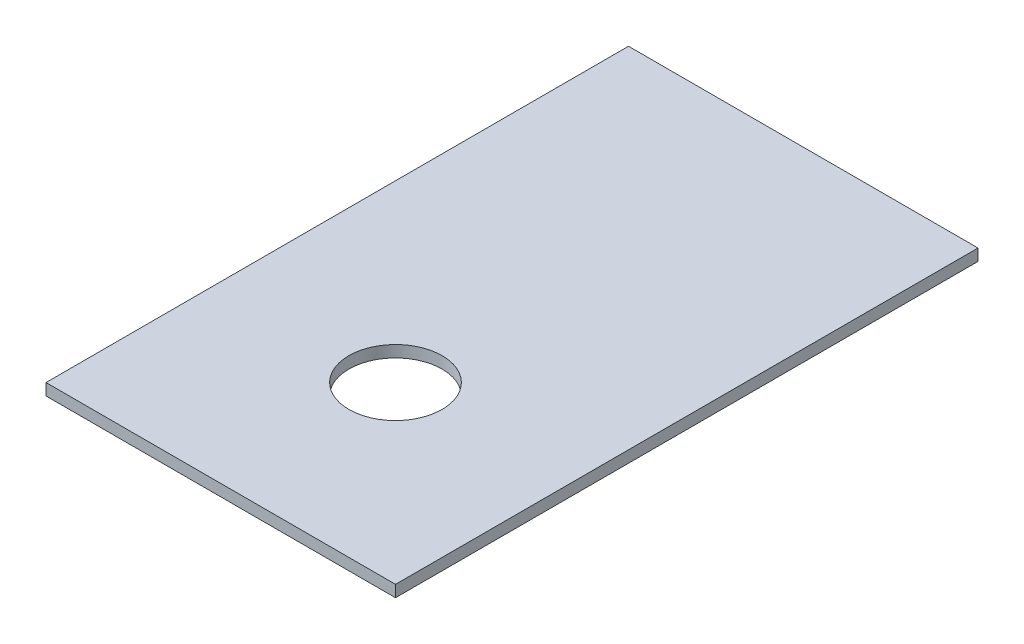
ISO-10303-21;
HEADER;
FILE_DESCRIPTION(('STEP AP214'),'2;1');
FILE_NAME('part.step','',(''),(''),'','','');
FILE_SCHEMA(('AUTOMOTIVE_DESIGN { 1 0 10303 214 1 1 1 1 }'));
ENDSEC;
DATA;
#1=APPLICATION_CONTEXT('core data for automotive mechanical design processes');
#2=APPLICATION_PROTOCOL_DEFINITION('international standard','automotive_design',2000,#1);
#3=PRODUCT_CONTEXT('',#1,'mechanical');
#4=PRODUCT('Part','Part','',(#3));
#5=PRODUCT_RELATED_PRODUCT_CATEGORY('part','',(#4));
#6=PRODUCT_DEFINITION_FORMATION('','',#4);
#7=PRODUCT_DEFINITION_CONTEXT('part definition',#1,'design');
#8=PRODUCT_DEFINITION('design','',#6,#7);
#9=PRODUCT_DEFINITION_SHAPE('','',#8);
#10=(LENGTH_UNIT() NAMED_UNIT(*) SI_UNIT(.MILLI.,.METRE.));
#11=(NAMED_UNIT(*) PLANE_ANGLE_UNIT() SI_UNIT($,.RADIAN.));
#12=(NAMED_UNIT(*) SI_UNIT($,.STERADIAN.) SOLID_ANGLE_UNIT());
#13=UNCERTAINTY_MEASURE_WITH_UNIT(LENGTH_MEASURE(1.E-05),#10,'distance_accuracy_value','');
#14=(GEOMETRIC_REPRESENTATION_CONTEXT(3) GLOBAL_UNCERTAINTY_ASSIGNED_CONTEXT((#13)) GLOBAL_UNIT_ASSIGNED_CONTEXT((#10,
#11,#12)) REPRESENTATION_CONTEXT('',''));
#15=CARTESIAN_POINT('',(0.,0.,0.));
#16=DIRECTION('',(0.,0.,1.));
#17=DIRECTION('',(1.,0.,0.));
#18=AXIS2_PLACEMENT_3D('',#15,#16,#17);
#19=CARTESIAN_POINT('',(0.,-0.01,0.85));
#20=DIRECTION('',(0.,1.,0.));
#21=DIRECTION('',(1.,0.,0.));
#22=AXIS2_PLACEMENT_3D('',#19,#20,#21);
#23=CYLINDRICAL_SURFACE('',#22,0.04);
#24=CARTESIAN_POINT('',(-0.04,-0.01,0.85));
#25=CARTESIAN_POINT('',(-0.04,0.,0.85));
#26=(BOUNDED_CURVE() B_SPLINE_CURVE(1,(#24,#25),.UNSPECIFIED.,.F.,
.F.) B_SPLINE_CURVE_WITH_KNOTS((2,2),(0.,0.01),
.UNSPECIFIED.) CURVE() GEOMETRIC_REPRESENTATION_ITEM() RATIONAL_B_SPLINE_CURVE((1.,1.)) REPRESENTATION_ITEM(''));
#27=CARTESIAN_POINT('',(-0.04,-0.01,0.85));
#28=VERTEX_POINT('',#27);
#29=CARTESIAN_POINT('',(-0.04,0.,0.85));
#30=VERTEX_POINT('',#29);
#31=EDGE_CURVE('E11',#28,#30,#26,.T.);
#32=ORIENTED_EDGE('',*,*,#31,.T.);
#33=CARTESIAN_POINT('',(0.,0.,0.85));
#34=DIRECTION('',(0.,-1.,0.));
#35=DIRECTION('',(1.,0.,0.));
#36=AXIS2_PLACEMENT_3D('',#33,#34,#35);
#37=CIRCLE('',#36,0.04);
#38=EDGE_CURVE('E136',#30,#30,#37,.T.);
#39=ORIENTED_EDGE('',*,*,#38,.F.);
#40=ORIENTED_EDGE('',*,*,#31,.F.);
#41=CARTESIAN_POINT('',(0.,-0.01,0.85));
#42=DIRECTION('',(0.,1.,0.));
#43=DIRECTION('',(1.,0.,0.));
#44=AXIS2_PLACEMENT_3D('',#41,#42,#43);
#45=CIRCLE('',#44,0.04);
#46=EDGE_CURVE('E21',#28,#28,#45,.T.);
#47=ORIENTED_EDGE('',*,*,#46,.F.);
#48=EDGE_LOOP('',(#32,#39,#40,#47));
#49=FACE_BOUND('',#48,.T.);
#50=ADVANCED_FACE('F17',(#49),#23,.F.);
#51=CARTESIAN_POINT('',(-0.15,0.,0.5));
#52=DIRECTION('',(0.,0.,-1.));
#53=DIRECTION('',(0.,-1.,0.));
#54=AXIS2_PLACEMENT_3D('',#51,#52,#53);
#55=PLANE('',#54);
#56=DIRECTION('',(1.,0.,0.));
#57=VECTOR('',#56,1.);
#58=CARTESIAN_POINT('',(-0.15,0.,0.5));
#59=LINE('',#58,#57);
#60=CARTESIAN_POINT('',(-0.15,0.,0.5));
#61=VERTEX_POINT('',#60);
#62=CARTESIAN_POINT('',(0.15,0.,0.5));
#63=VERTEX_POINT('',#62);
#64=EDGE_CURVE('E127',#61,#63,#59,.T.);
#65=ORIENTED_EDGE('',*,*,#64,.T.);
#66=DIRECTION('',(0.,-1.,0.));
#67=VECTOR('',#66,1.);
#68=CARTESIAN_POINT('',(0.15,0.,0.5));
#69=LINE('',#68,#67);
#70=CARTESIAN_POINT('',(0.15,-0.01,0.5));
#71=VERTEX_POINT('',#70);
#72=EDGE_CURVE('E79',#63,#71,#69,.T.);
#73=ORIENTED_EDGE('',*,*,#72,.T.);
#74=DIRECTION('',(1.,0.,0.));
#75=VECTOR('',#74,1.);
#76=CARTESIAN_POINT('',(-0.15,-0.01,0.5));
#77=LINE('',#76,#75);
#78=CARTESIAN_POINT('',(-0.15,-0.01,0.5));
#79=VERTEX_POINT('',#78);
#80=EDGE_CURVE('E92',#79,#71,#77,.T.);
#81=ORIENTED_EDGE('',*,*,#80,.F.);
#82=DIRECTION('',(0.,-1.,0.));
#83=VECTOR('',#82,1.);
#84=CARTESIAN_POINT('',(-0.15,0.,0.5));
#85=LINE('',#84,#83);
#86=EDGE_CURVE('E28',#61,#79,#85,.T.);
#87=ORIENTED_EDGE('',*,*,#86,.F.);
#88=EDGE_LOOP('',(#65,#73,#81,#87));
#89=FACE_BOUND('',#88,.T.);
#90=ADVANCED_FACE('F219',(#89),#55,.T.);
#91=CARTESIAN_POINT('',(-0.15,0.,1.));
#92=DIRECTION('',(-1.,0.,0.));
#93=DIRECTION('',(0.,1.,0.));
#94=AXIS2_PLACEMENT_3D('',#91,#92,#93);
#95=PLANE('',#94);
#96=DIRECTION('',(0.,0.,-1.));
#97=VECTOR('',#96,1.);
#98=CARTESIAN_POINT('',(-0.15,0.,1.));
#99=LINE('',#98,#97);
#100=CARTESIAN_POINT('',(-0.15,0.,1.));
#101=VERTEX_POINT('',#100);
#102=EDGE_CURVE('E125',#101,#61,#99,.T.);
#103=ORIENTED_EDGE('',*,*,#102,.T.);
#104=ORIENTED_EDGE('',*,*,#86,.T.);
#105=DIRECTION('',(0.,0.,-1.));
#106=VECTOR('',#105,1.);
#107=CARTESIAN_POINT('',(-0.15,-0.01,1.));
#108=LINE('',#107,#106);
#109=CARTESIAN_POINT('',(-0.15,-0.01,1.));
#110=VERTEX_POINT('',#109);
#111=EDGE_CURVE('E101',#110,#79,#108,.T.);
#112=ORIENTED_EDGE('',*,*,#111,.F.);
#113=DIRECTION('',(0.,-1.,0.));
#114=VECTOR('',#113,1.);
#115=CARTESIAN_POINT('',(-0.15,0.,1.));
#116=LINE('',#115,#114);
#117=EDGE_CURVE('E97',#101,#110,#116,.T.);
#118=ORIENTED_EDGE('',*,*,#117,.F.);
#119=EDGE_LOOP('',(#103,#104,#112,#118));
#120=FACE_BOUND('',#119,.T.);
#121=ADVANCED_FACE('F19',(#120),#95,.T.);
#122=CARTESIAN_POINT('',(0.15,0.,1.));
#123=DIRECTION('',(0.,0.,1.));
#124=DIRECTION('',(1.,0.,0.));
#125=AXIS2_PLACEMENT_3D('',#122,#123,#124);
#126=PLANE('',#125);
#127=DIRECTION('',(-1.,0.,0.));
#128=VECTOR('',#127,1.);
#129=CARTESIAN_POINT('',(1.,0.,1.));
#130=LINE('',#129,#128);
#131=CARTESIAN_POINT('',(0.15,0.,1.));
#132=VERTEX_POINT('',#131);
#133=EDGE_CURVE('E113',#132,#101,#130,.T.);
#134=ORIENTED_EDGE('',*,*,#133,.T.);
#135=ORIENTED_EDGE('',*,*,#117,.T.);
#136=DIRECTION('',(-1.,0.,0.));
#137=VECTOR('',#136,1.);
#138=CARTESIAN_POINT('',(1.,-0.01,1.));
#139=LINE('',#138,#137);
#140=CARTESIAN_POINT('',(0.15,-0.01,1.));
#141=VERTEX_POINT('',#140);
#142=EDGE_CURVE('E95',#141,#110,#139,.T.);
#143=ORIENTED_EDGE('',*,*,#142,.F.);
#144=DIRECTION('',(0.,-1.,0.));
#145=VECTOR('',#144,1.);
#146=CARTESIAN_POINT('',(0.15,0.,1.));
#147=LINE('',#146,#145);
#148=EDGE_CURVE('E67',#132,#141,#147,.T.);
#149=ORIENTED_EDGE('',*,*,#148,.F.);
#150=EDGE_LOOP('',(#134,#135,#143,#149));
#151=FACE_BOUND('',#150,.T.);
#152=ADVANCED_FACE('F96',(#151),#126,.T.);
#153=CARTESIAN_POINT('',(0.15,0.,0.5));
#154=DIRECTION('',(1.,0.,0.));
#155=DIRECTION('',(0.,0.,-1.));
#156=AXIS2_PLACEMENT_3D('',#153,#154,#155);
#157=PLANE('',#156);
#158=DIRECTION('',(0.,0.,1.));
#159=VECTOR('',#158,1.);
#160=CARTESIAN_POINT('',(0.15,0.,0.5));
#161=LINE('',#160,#159);
#162=EDGE_CURVE('E90',#63,#132,#161,.T.);
#163=ORIENTED_EDGE('',*,*,#162,.T.);
#164=ORIENTED_EDGE('',*,*,#148,.T.);
#165=DIRECTION('',(0.,0.,1.));
#166=VECTOR('',#165,1.);
#167=CARTESIAN_POINT('',(0.15,-0.01,0.5));
#168=LINE('',#167,#166);
#169=EDGE_CURVE('E88',#71,#141,#168,.T.);
#170=ORIENTED_EDGE('',*,*,#169,.F.);
#171=ORIENTED_EDGE('',*,*,#72,.F.);
#172=EDGE_LOOP('',(#163,#164,#170,#171));
#173=FACE_BOUND('',#172,.T.);
#174=ADVANCED_FACE('F86',(#173),#157,.T.);
#175=CARTESIAN_POINT('',(0.,-0.01,0.75));
#176=DIRECTION('',(0.,-1.,0.));
#177=DIRECTION('',(0.,0.,-1.));
#178=AXIS2_PLACEMENT_3D('',#175,#176,#177);
#179=PLANE('',#178);
#180=ORIENTED_EDGE('',*,*,#169,.T.);
#181=ORIENTED_EDGE('',*,*,#142,.T.);
#182=ORIENTED_EDGE('',*,*,#111,.T.);
#183=ORIENTED_EDGE('',*,*,#80,.T.);
#184=EDGE_LOOP('',(#180,#181,#182,#183));
#185=FACE_BOUND('',#184,.T.);
#186=ORIENTED_EDGE('',*,*,#46,.T.);
#187=EDGE_LOOP('',(#186));
#188=FACE_BOUND('',#187,.T.);
#189=ADVANCED_FACE('F104',(#185,#188),#179,.T.);
#190=CARTESIAN_POINT('',(0.,0.,0.75));
#191=DIRECTION('',(0.,-1.,0.));
#192=DIRECTION('',(0.,0.,-1.));
#193=AXIS2_PLACEMENT_3D('',#190,#191,#192);
#194=PLANE('',#193);
#195=ORIENTED_EDGE('',*,*,#162,.F.);
#196=ORIENTED_EDGE('',*,*,#64,.F.);
#197=ORIENTED_EDGE('',*,*,#102,.F.);
#198=ORIENTED_EDGE('',*,*,#133,.F.);
#199=EDGE_LOOP('',(#195,#196,#197,#198));
#200=FACE_BOUND('',#199,.T.);
#201=ORIENTED_EDGE('',*,*,#38,.T.);
#202=EDGE_LOOP('',(#201));
#203=FACE_BOUND('',#202,.T.);
#204=ADVANCED_FACE('F184',(#200,#203),#194,.F.);
#205=CLOSED_SHELL('',(#50,#90,#121,#152,#174,#189,#204));
#206=MANIFOLD_SOLID_BREP('B1',#205);
#207=ADVANCED_BREP_SHAPE_REPRESENTATION('',(#18,#206),#14);
#208=SHAPE_DEFINITION_REPRESENTATION(#9,#207);
ENDSEC;
END-ISO-10303-21;
